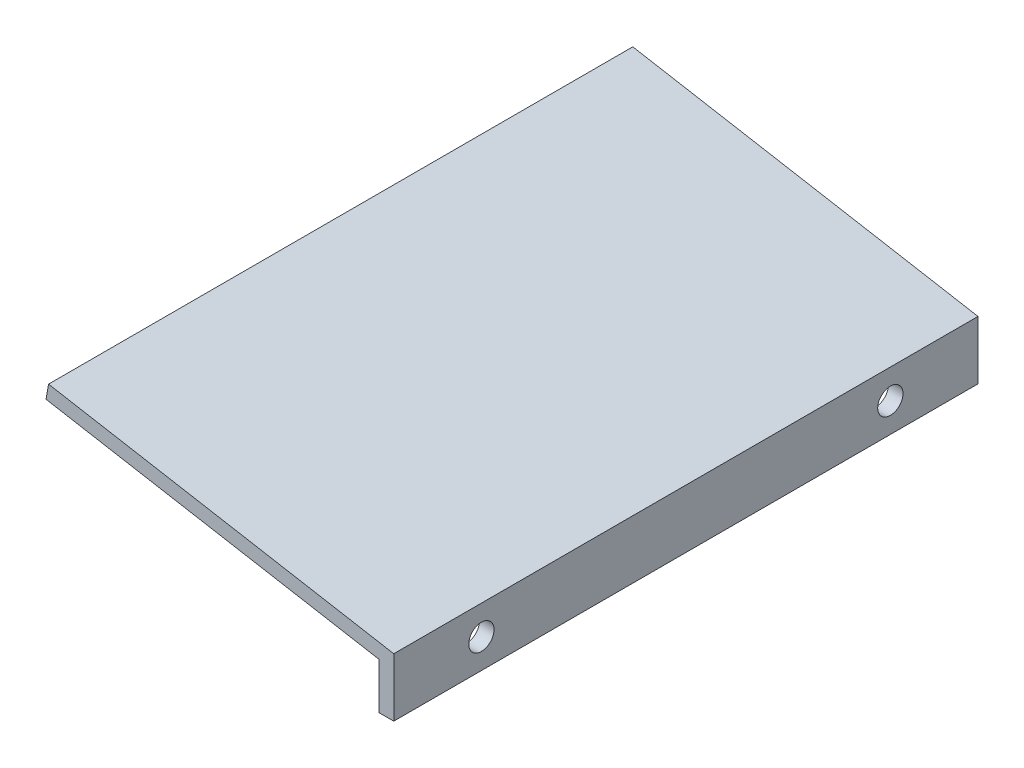
ISO-10303-21;
HEADER;
FILE_DESCRIPTION(('STEP AP214'),'2;1');
FILE_NAME('part.step','',(''),(''),'','','');
FILE_SCHEMA(('AUTOMOTIVE_DESIGN { 1 0 10303 214 1 1 1 1 }'));
ENDSEC;
DATA;
#1=APPLICATION_CONTEXT('core data for automotive mechanical design processes');
#2=APPLICATION_PROTOCOL_DEFINITION('international standard','automotive_design',2000,#1);
#3=PRODUCT_CONTEXT('',#1,'mechanical');
#4=PRODUCT('Part','Part','',(#3));
#5=PRODUCT_RELATED_PRODUCT_CATEGORY('part','',(#4));
#6=PRODUCT_DEFINITION_FORMATION('','',#4);
#7=PRODUCT_DEFINITION_CONTEXT('part definition',#1,'design');
#8=PRODUCT_DEFINITION('design','',#6,#7);
#9=PRODUCT_DEFINITION_SHAPE('','',#8);
#10=(LENGTH_UNIT() NAMED_UNIT(*) SI_UNIT(.MILLI.,.METRE.));
#11=(NAMED_UNIT(*) PLANE_ANGLE_UNIT() SI_UNIT($,.RADIAN.));
#12=(NAMED_UNIT(*) SI_UNIT($,.STERADIAN.) SOLID_ANGLE_UNIT());
#13=UNCERTAINTY_MEASURE_WITH_UNIT(LENGTH_MEASURE(1.E-05),#10,'distance_accuracy_value','');
#14=(GEOMETRIC_REPRESENTATION_CONTEXT(3) GLOBAL_UNCERTAINTY_ASSIGNED_CONTEXT((#13)) GLOBAL_UNIT_ASSIGNED_CONTEXT((#10,
#11,#12)) REPRESENTATION_CONTEXT('',''));
#15=CARTESIAN_POINT('',(0.,0.,0.));
#16=DIRECTION('',(0.,0.,1.));
#17=DIRECTION('',(1.,0.,0.));
#18=AXIS2_PLACEMENT_3D('',#15,#16,#17);
#19=CARTESIAN_POINT('',(3.175,0.,127.));
#20=DIRECTION('',(0.,1.,0.));
#21=DIRECTION('',(-1.,0.,0.));
#22=AXIS2_PLACEMENT_3D('',#19,#20,#21);
#23=PLANE('',#22);
#24=DIRECTION('',(1.,0.,0.));
#25=VECTOR('',#24,1.);
#26=CARTESIAN_POINT('',(3.175,0.,0.));
#27=LINE('',#26,#25);
#28=CARTESIAN_POINT('',(0.,0.,0.));
#29=VERTEX_POINT('',#28);
#30=CARTESIAN_POINT('',(3.175,0.,0.));
#31=VERTEX_POINT('',#30);
#32=EDGE_CURVE('E118',#29,#31,#27,.T.);
#33=ORIENTED_EDGE('',*,*,#32,.T.);
#34=DIRECTION('',(0.,0.,-1.));
#35=VECTOR('',#34,1.);
#36=CARTESIAN_POINT('',(3.175,0.,127.));
#37=LINE('',#36,#35);
#38=CARTESIAN_POINT('',(3.175,0.,127.));
#39=VERTEX_POINT('',#38);
#40=EDGE_CURVE('E11',#39,#31,#37,.T.);
#41=ORIENTED_EDGE('',*,*,#40,.F.);
#42=DIRECTION('',(1.,0.,0.));
#43=VECTOR('',#42,1.);
#44=CARTESIAN_POINT('',(3.175,0.,127.));
#45=LINE('',#44,#43);
#46=CARTESIAN_POINT('',(0.,0.,127.));
#47=VERTEX_POINT('',#46);
#48=EDGE_CURVE('E129',#47,#39,#45,.T.);
#49=ORIENTED_EDGE('',*,*,#48,.F.);
#50=DIRECTION('',(0.,0.,-1.));
#51=VECTOR('',#50,1.);
#52=CARTESIAN_POINT('',(0.,0.,127.));
#53=LINE('',#52,#51);
#54=EDGE_CURVE('E114',#47,#29,#53,.T.);
#55=ORIENTED_EDGE('',*,*,#54,.T.);
#56=EDGE_LOOP('',(#33,#41,#49,#55));
#57=FACE_BOUND('',#56,.T.);
#58=ADVANCED_FACE('F33',(#57),#23,.F.);
#59=CARTESIAN_POINT('',(3.175,12.7,127.));
#60=DIRECTION('',(-1.,0.,0.));
#61=DIRECTION('',(0.,-1.,0.));
#62=AXIS2_PLACEMENT_3D('',#59,#60,#61);
#63=PLANE('',#62);
#64=CARTESIAN_POINT('',(3.175,6.35,107.95));
#65=DIRECTION('',(1.,0.,0.));
#66=DIRECTION('',(0.,0.,-1.));
#67=AXIS2_PLACEMENT_3D('',#64,#65,#66);
#68=CIRCLE('',#67,2.74999999999999);
#69=CARTESIAN_POINT('',(3.175,6.35,105.2));
#70=VERTEX_POINT('',#69);
#71=EDGE_CURVE('E227',#70,#70,#68,.T.);
#72=ORIENTED_EDGE('',*,*,#71,.F.);
#73=EDGE_LOOP('',(#72));
#74=FACE_BOUND('',#73,.T.);
#75=CARTESIAN_POINT('',(3.175,6.35,19.05));
#76=DIRECTION('',(1.,0.,0.));
#77=DIRECTION('',(0.,0.,-1.));
#78=AXIS2_PLACEMENT_3D('',#75,#76,#77);
#79=CIRCLE('',#78,2.74999999999999);
#80=CARTESIAN_POINT('',(3.175,6.35,16.3));
#81=VERTEX_POINT('',#80);
#82=EDGE_CURVE('E229',#81,#81,#79,.T.);
#83=ORIENTED_EDGE('',*,*,#82,.F.);
#84=EDGE_LOOP('',(#83));
#85=FACE_BOUND('',#84,.T.);
#86=DIRECTION('',(0.,1.,0.));
#87=VECTOR('',#86,1.);
#88=CARTESIAN_POINT('',(3.175,12.7,0.));
#89=LINE('',#88,#87);
#90=CARTESIAN_POINT('',(3.175,12.7,0.));
#91=VERTEX_POINT('',#90);
#92=EDGE_CURVE('E121',#31,#91,#89,.T.);
#93=ORIENTED_EDGE('',*,*,#92,.T.);
#94=DIRECTION('',(0.,0.,-1.));
#95=VECTOR('',#94,1.);
#96=CARTESIAN_POINT('',(3.175,12.7,127.));
#97=LINE('',#96,#95);
#98=CARTESIAN_POINT('',(3.175,12.7,127.));
#99=VERTEX_POINT('',#98);
#100=EDGE_CURVE('E42',#99,#91,#97,.T.);
#101=ORIENTED_EDGE('',*,*,#100,.F.);
#102=DIRECTION('',(0.,1.,0.));
#103=VECTOR('',#102,1.);
#104=CARTESIAN_POINT('',(3.175,12.7,127.));
#105=LINE('',#104,#103);
#106=EDGE_CURVE('E87',#39,#99,#105,.T.);
#107=ORIENTED_EDGE('',*,*,#106,.F.);
#108=ORIENTED_EDGE('',*,*,#40,.T.);
#109=EDGE_LOOP('',(#93,#101,#107,#108));
#110=FACE_BOUND('',#109,.T.);
#111=ADVANCED_FACE('F157',(#74,#85,#110),#63,.F.);
#112=CARTESIAN_POINT('',(-71.8673507795303,25.9319911382198,127.));
#113=DIRECTION('',(-0.173648177666926,-0.984807753012209,0.));
#114=DIRECTION('',(0.984807753012209,-0.173648177666926,0.));
#115=AXIS2_PLACEMENT_3D('',#112,#113,#114);
#116=PLANE('',#115);
#117=DIRECTION('',(-0.984807753012209,0.173648177666926,0.));
#118=VECTOR('',#117,1.);
#119=CARTESIAN_POINT('',(-71.8673507795303,25.9319911382198,0.));
#120=LINE('',#119,#118);
#121=CARTESIAN_POINT('',(-71.8673507795303,25.9319911382198,0.));
#122=VERTEX_POINT('',#121);
#123=EDGE_CURVE('E124',#91,#122,#120,.T.);
#124=ORIENTED_EDGE('',*,*,#123,.T.);
#125=DIRECTION('',(0.,0.,-1.));
#126=VECTOR('',#125,1.);
#127=CARTESIAN_POINT('',(-71.8673507795303,25.9319911382198,127.));
#128=LINE('',#127,#126);
#129=CARTESIAN_POINT('',(-71.8673507795303,25.9319911382198,127.));
#130=VERTEX_POINT('',#129);
#131=EDGE_CURVE('E109',#130,#122,#128,.T.);
#132=ORIENTED_EDGE('',*,*,#131,.F.);
#133=DIRECTION('',(-0.984807753012209,0.173648177666926,0.));
#134=VECTOR('',#133,1.);
#135=CARTESIAN_POINT('',(-71.8673507795303,25.9319911382198,127.));
#136=LINE('',#135,#134);
#137=EDGE_CURVE('E100',#99,#130,#136,.T.);
#138=ORIENTED_EDGE('',*,*,#137,.F.);
#139=ORIENTED_EDGE('',*,*,#100,.T.);
#140=EDGE_LOOP('',(#124,#132,#138,#139));
#141=FACE_BOUND('',#140,.T.);
#142=ADVANCED_FACE('F136',(#141),#116,.F.);
#143=CARTESIAN_POINT('',(-72.4186837436228,22.805226522406,127.));
#144=DIRECTION('',(0.984807753012209,-0.173648177666926,0.));
#145=DIRECTION('',(0.173648177666926,0.984807753012209,0.));
#146=AXIS2_PLACEMENT_3D('',#143,#144,#145);
#147=PLANE('',#146);
#148=DIRECTION('',(-0.173648177666926,-0.984807753012209,0.));
#149=VECTOR('',#148,1.);
#150=CARTESIAN_POINT('',(-72.4186837436228,22.805226522406,0.));
#151=LINE('',#150,#149);
#152=CARTESIAN_POINT('',(-72.4186837436228,22.805226522406,0.));
#153=VERTEX_POINT('',#152);
#154=EDGE_CURVE('E108',#122,#153,#151,.T.);
#155=ORIENTED_EDGE('',*,*,#154,.T.);
#156=DIRECTION('',(0.,0.,-1.));
#157=VECTOR('',#156,1.);
#158=CARTESIAN_POINT('',(-72.4186837436228,22.805226522406,127.));
#159=LINE('',#158,#157);
#160=CARTESIAN_POINT('',(-72.4186837436228,22.805226522406,127.));
#161=VERTEX_POINT('',#160);
#162=EDGE_CURVE('E105',#161,#153,#159,.T.);
#163=ORIENTED_EDGE('',*,*,#162,.F.);
#164=DIRECTION('',(-0.173648177666926,-0.984807753012209,0.));
#165=VECTOR('',#164,1.);
#166=CARTESIAN_POINT('',(-72.4186837436228,22.805226522406,127.));
#167=LINE('',#166,#165);
#168=EDGE_CURVE('E94',#130,#161,#167,.T.);
#169=ORIENTED_EDGE('',*,*,#168,.F.);
#170=ORIENTED_EDGE('',*,*,#131,.T.);
#171=EDGE_LOOP('',(#155,#163,#169,#170));
#172=FACE_BOUND('',#171,.T.);
#173=ADVANCED_FACE('F106',(#172),#147,.F.);
#174=CARTESIAN_POINT('',(0.,10.0358586710121,127.));
#175=DIRECTION('',(0.173648177666927,0.984807753012209,0.));
#176=DIRECTION('',(-0.984807753012209,0.173648177666926,0.));
#177=AXIS2_PLACEMENT_3D('',#174,#175,#176);
#178=PLANE('',#177);
#179=DIRECTION('',(0.984807753012209,-0.173648177666926,0.));
#180=VECTOR('',#179,1.);
#181=CARTESIAN_POINT('',(0.,10.0358586710121,0.));
#182=LINE('',#181,#180);
#183=CARTESIAN_POINT('',(0.,10.0358586710121,0.));
#184=VERTEX_POINT('',#183);
#185=EDGE_CURVE('E73',#153,#184,#182,.T.);
#186=ORIENTED_EDGE('',*,*,#185,.T.);
#187=DIRECTION('',(0.,0.,-1.));
#188=VECTOR('',#187,1.);
#189=CARTESIAN_POINT('',(0.,10.0358586710121,127.));
#190=LINE('',#189,#188);
#191=CARTESIAN_POINT('',(0.,10.0358586710121,127.));
#192=VERTEX_POINT('',#191);
#193=EDGE_CURVE('E110',#192,#184,#190,.T.);
#194=ORIENTED_EDGE('',*,*,#193,.F.);
#195=DIRECTION('',(0.984807753012209,-0.173648177666926,0.));
#196=VECTOR('',#195,1.);
#197=CARTESIAN_POINT('',(0.,10.0358586710121,127.));
#198=LINE('',#197,#196);
#199=EDGE_CURVE('E98',#161,#192,#198,.T.);
#200=ORIENTED_EDGE('',*,*,#199,.F.);
#201=ORIENTED_EDGE('',*,*,#162,.T.);
#202=EDGE_LOOP('',(#186,#194,#200,#201));
#203=FACE_BOUND('',#202,.T.);
#204=ADVANCED_FACE('F112',(#203),#178,.F.);
#205=CARTESIAN_POINT('',(0.,0.,127.));
#206=DIRECTION('',(1.,0.,0.));
#207=DIRECTION('',(0.,1.,0.));
#208=AXIS2_PLACEMENT_3D('',#205,#206,#207);
#209=PLANE('',#208);
#210=CARTESIAN_POINT('',(0.,6.35,107.95));
#211=DIRECTION('',(1.,0.,0.));
#212=DIRECTION('',(0.,1.,0.));
#213=AXIS2_PLACEMENT_3D('',#210,#211,#212);
#214=CIRCLE('',#213,2.74999999999998);
#215=CARTESIAN_POINT('',(0.,9.09999999999999,107.95));
#216=VERTEX_POINT('',#215);
#217=EDGE_CURVE('E36',#216,#216,#214,.T.);
#218=ORIENTED_EDGE('',*,*,#217,.T.);
#219=EDGE_LOOP('',(#218));
#220=FACE_BOUND('',#219,.T.);
#221=CARTESIAN_POINT('',(0.,6.35,19.05));
#222=DIRECTION('',(1.,0.,0.));
#223=DIRECTION('',(0.,1.,0.));
#224=AXIS2_PLACEMENT_3D('',#221,#222,#223);
#225=CIRCLE('',#224,2.74999999999998);
#226=CARTESIAN_POINT('',(0.,9.09999999999999,19.05));
#227=VERTEX_POINT('',#226);
#228=EDGE_CURVE('E122',#227,#227,#225,.T.);
#229=ORIENTED_EDGE('',*,*,#228,.T.);
#230=EDGE_LOOP('',(#229));
#231=FACE_BOUND('',#230,.T.);
#232=DIRECTION('',(0.,-1.,0.));
#233=VECTOR('',#232,1.);
#234=CARTESIAN_POINT('',(0.,0.,0.));
#235=LINE('',#234,#233);
#236=EDGE_CURVE('E79',#184,#29,#235,.T.);
#237=ORIENTED_EDGE('',*,*,#236,.T.);
#238=ORIENTED_EDGE('',*,*,#54,.F.);
#239=DIRECTION('',(0.,-1.,0.));
#240=VECTOR('',#239,1.);
#241=CARTESIAN_POINT('',(0.,0.,127.));
#242=LINE('',#241,#240);
#243=EDGE_CURVE('E50',#192,#47,#242,.T.);
#244=ORIENTED_EDGE('',*,*,#243,.F.);
#245=ORIENTED_EDGE('',*,*,#193,.T.);
#246=EDGE_LOOP('',(#237,#238,#244,#245));
#247=FACE_BOUND('',#246,.T.);
#248=ADVANCED_FACE('F143',(#220,#231,#247),#209,.F.);
#249=CARTESIAN_POINT('',(0.,0.,127.));
#250=DIRECTION('',(0.,0.,-1.));
#251=DIRECTION('',(-1.,0.,0.));
#252=AXIS2_PLACEMENT_3D('',#249,#250,#251);
#253=PLANE('',#252);
#254=ORIENTED_EDGE('',*,*,#48,.T.);
#255=ORIENTED_EDGE('',*,*,#106,.T.);
#256=ORIENTED_EDGE('',*,*,#137,.T.);
#257=ORIENTED_EDGE('',*,*,#168,.T.);
#258=ORIENTED_EDGE('',*,*,#199,.T.);
#259=ORIENTED_EDGE('',*,*,#243,.T.);
#260=EDGE_LOOP('',(#254,#255,#256,#257,#258,#259));
#261=FACE_BOUND('',#260,.T.);
#262=ADVANCED_FACE('F96',(#261),#253,.F.);
#263=CARTESIAN_POINT('',(0.,0.,0.));
#264=DIRECTION('',(0.,0.,-1.));
#265=DIRECTION('',(-1.,0.,0.));
#266=AXIS2_PLACEMENT_3D('',#263,#264,#265);
#267=PLANE('',#266);
#268=ORIENTED_EDGE('',*,*,#32,.F.);
#269=ORIENTED_EDGE('',*,*,#236,.F.);
#270=ORIENTED_EDGE('',*,*,#185,.F.);
#271=ORIENTED_EDGE('',*,*,#154,.F.);
#272=ORIENTED_EDGE('',*,*,#123,.F.);
#273=ORIENTED_EDGE('',*,*,#92,.F.);
#274=EDGE_LOOP('',(#268,#269,#270,#271,#272,#273));
#275=FACE_BOUND('',#274,.T.);
#276=ADVANCED_FACE('F139',(#275),#267,.T.);
#277=CARTESIAN_POINT('',(3.175,6.35,19.05));
#278=DIRECTION('',(1.,0.,0.));
#279=DIRECTION('',(0.,0.,-1.));
#280=AXIS2_PLACEMENT_3D('',#277,#278,#279);
#281=CYLINDRICAL_SURFACE('',#280,2.74999999999998);
#282=ORIENTED_EDGE('',*,*,#82,.T.);
#283=EDGE_LOOP('',(#282));
#284=FACE_BOUND('',#283,.T.);
#285=ORIENTED_EDGE('',*,*,#228,.F.);
#286=EDGE_LOOP('',(#285));
#287=FACE_BOUND('',#286,.T.);
#288=ADVANCED_FACE('F193',(#284,#287),#281,.F.);
#289=CARTESIAN_POINT('',(3.175,6.35,107.95));
#290=DIRECTION('',(1.,0.,0.));
#291=DIRECTION('',(0.,0.,-1.));
#292=AXIS2_PLACEMENT_3D('',#289,#290,#291);
#293=CYLINDRICAL_SURFACE('',#292,2.74999999999998);
#294=ORIENTED_EDGE('',*,*,#71,.T.);
#295=EDGE_LOOP('',(#294));
#296=FACE_BOUND('',#295,.T.);
#297=ORIENTED_EDGE('',*,*,#217,.F.);
#298=EDGE_LOOP('',(#297));
#299=FACE_BOUND('',#298,.T.);
#300=ADVANCED_FACE('F211',(#296,#299),#293,.F.);
#301=CLOSED_SHELL('',(#58,#111,#142,#173,#204,#248,#262,#276,#288,#300));
#302=MANIFOLD_SOLID_BREP('B2',#301);
#303=ADVANCED_BREP_SHAPE_REPRESENTATION('',(#18,#302),#14);
#304=SHAPE_DEFINITION_REPRESENTATION(#9,#303);
ENDSEC;
END-ISO-10303-21;
